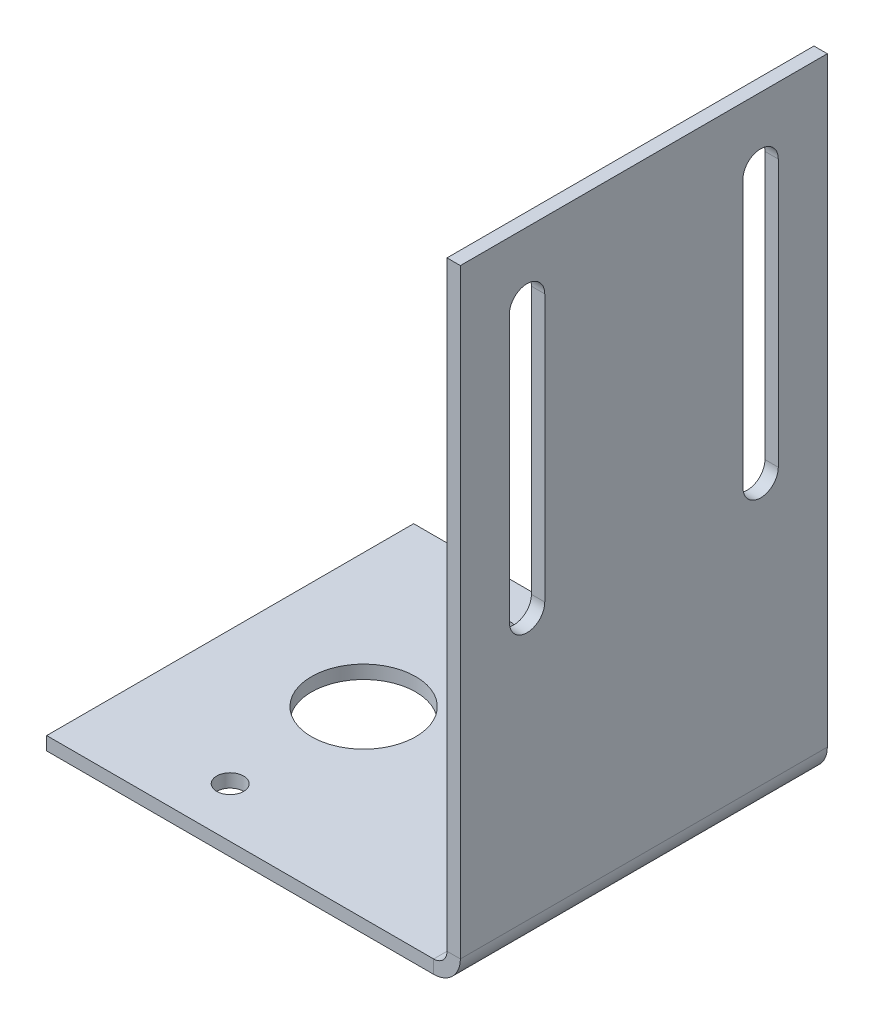
ISO-10303-21;
HEADER;
FILE_DESCRIPTION(('STEP AP214'),'2;1');
FILE_NAME('part.step','',(''),(''),'','','');
FILE_SCHEMA(('AUTOMOTIVE_DESIGN { 1 0 10303 214 1 1 1 1 }'));
ENDSEC;
DATA;
#1=APPLICATION_CONTEXT('core data for automotive mechanical design processes');
#2=APPLICATION_PROTOCOL_DEFINITION('international standard','automotive_design',2000,#1);
#3=PRODUCT_CONTEXT('',#1,'mechanical');
#4=PRODUCT('Part','Part','',(#3));
#5=PRODUCT_RELATED_PRODUCT_CATEGORY('part','',(#4));
#6=PRODUCT_DEFINITION_FORMATION('','',#4);
#7=PRODUCT_DEFINITION_CONTEXT('part definition',#1,'design');
#8=PRODUCT_DEFINITION('design','',#6,#7);
#9=PRODUCT_DEFINITION_SHAPE('','',#8);
#10=(LENGTH_UNIT() NAMED_UNIT(*) SI_UNIT(.MILLI.,.METRE.));
#11=(NAMED_UNIT(*) PLANE_ANGLE_UNIT() SI_UNIT($,.RADIAN.));
#12=(NAMED_UNIT(*) SI_UNIT($,.STERADIAN.) SOLID_ANGLE_UNIT());
#13=UNCERTAINTY_MEASURE_WITH_UNIT(LENGTH_MEASURE(1.E-05),#10,'distance_accuracy_value','');
#14=(GEOMETRIC_REPRESENTATION_CONTEXT(3) GLOBAL_UNCERTAINTY_ASSIGNED_CONTEXT((#13)) GLOBAL_UNIT_ASSIGNED_CONTEXT((#10,
#11,#12)) REPRESENTATION_CONTEXT('',''));
#15=CARTESIAN_POINT('',(0.,0.,0.));
#16=DIRECTION('',(0.,0.,1.));
#17=DIRECTION('',(1.,0.,0.));
#18=AXIS2_PLACEMENT_3D('',#15,#16,#17);
#19=CARTESIAN_POINT('',(0.,0.,0.));
#20=DIRECTION('',(0.,0.,-1.));
#21=DIRECTION('',(1.,0.,0.));
#22=AXIS2_PLACEMENT_3D('',#19,#20,#21);
#23=PLANE('',#22);
#24=DIRECTION('',(0.,-1.,0.));
#25=VECTOR('',#24,1.);
#26=CARTESIAN_POINT('',(73.66,0.,0.));
#27=LINE('',#26,#25);
#28=CARTESIAN_POINT('',(73.66,2.54,0.));
#29=VERTEX_POINT('',#28);
#30=CARTESIAN_POINT('',(73.66,0.,0.));
#31=VERTEX_POINT('',#30);
#32=EDGE_CURVE('E11',#29,#31,#27,.T.);
#33=ORIENTED_EDGE('',*,*,#32,.F.);
#34=DIRECTION('',(1.,0.,0.));
#35=VECTOR('',#34,1.);
#36=CARTESIAN_POINT('',(0.,2.54,0.));
#37=LINE('',#36,#35);
#38=CARTESIAN_POINT('',(0.,2.54,0.));
#39=VERTEX_POINT('',#38);
#40=EDGE_CURVE('E127',#39,#29,#37,.T.);
#41=ORIENTED_EDGE('',*,*,#40,.F.);
#42=DIRECTION('',(0.,-1.,0.));
#43=VECTOR('',#42,1.);
#44=CARTESIAN_POINT('',(0.,0.,0.));
#45=LINE('',#44,#43);
#46=CARTESIAN_POINT('',(0.,0.,0.));
#47=VERTEX_POINT('',#46);
#48=EDGE_CURVE('E63',#39,#47,#45,.T.);
#49=ORIENTED_EDGE('',*,*,#48,.T.);
#50=DIRECTION('',(1.,0.,0.));
#51=VECTOR('',#50,1.);
#52=CARTESIAN_POINT('',(0.,0.,0.));
#53=LINE('',#52,#51);
#54=EDGE_CURVE('E130',#47,#31,#53,.T.);
#55=ORIENTED_EDGE('',*,*,#54,.T.);
#56=EDGE_LOOP('',(#33,#41,#49,#55));
#57=FACE_BOUND('',#56,.T.);
#58=ADVANCED_FACE('F53',(#57),#23,.F.);
#59=CARTESIAN_POINT('',(0.,0.,-69.85));
#60=DIRECTION('',(1.,0.,0.));
#61=DIRECTION('',(0.,0.,1.));
#62=AXIS2_PLACEMENT_3D('',#59,#60,#61);
#63=PLANE('',#62);
#64=ORIENTED_EDGE('',*,*,#48,.F.);
#65=DIRECTION('',(0.,0.,-1.));
#66=VECTOR('',#65,1.);
#67=CARTESIAN_POINT('',(0.,2.54,-69.85));
#68=LINE('',#67,#66);
#69=CARTESIAN_POINT('',(0.,2.54,-69.85));
#70=VERTEX_POINT('',#69);
#71=EDGE_CURVE('E156',#70,#39,#68,.F.);
#72=ORIENTED_EDGE('',*,*,#71,.F.);
#73=DIRECTION('',(0.,-1.,0.));
#74=VECTOR('',#73,1.);
#75=CARTESIAN_POINT('',(0.,0.,-69.85));
#76=LINE('',#75,#74);
#77=CARTESIAN_POINT('',(0.,0.,-69.85));
#78=VERTEX_POINT('',#77);
#79=EDGE_CURVE('E217',#70,#78,#76,.T.);
#80=ORIENTED_EDGE('',*,*,#79,.T.);
#81=DIRECTION('',(0.,0.,1.));
#82=VECTOR('',#81,1.);
#83=CARTESIAN_POINT('',(0.,0.,-69.85));
#84=LINE('',#83,#82);
#85=EDGE_CURVE('E228',#78,#47,#84,.T.);
#86=ORIENTED_EDGE('',*,*,#85,.T.);
#87=EDGE_LOOP('',(#64,#72,#80,#86));
#88=FACE_BOUND('',#87,.T.);
#89=ADVANCED_FACE('F235',(#88),#63,.F.);
#90=CARTESIAN_POINT('',(0.,0.,-69.85));
#91=DIRECTION('',(0.,0.,-1.));
#92=DIRECTION('',(1.,0.,0.));
#93=AXIS2_PLACEMENT_3D('',#90,#91,#92);
#94=PLANE('',#93);
#95=ORIENTED_EDGE('',*,*,#79,.F.);
#96=DIRECTION('',(1.,0.,0.));
#97=VECTOR('',#96,1.);
#98=CARTESIAN_POINT('',(0.,2.54,-69.85));
#99=LINE('',#98,#97);
#100=CARTESIAN_POINT('',(73.66,2.54,-69.85));
#101=VERTEX_POINT('',#100);
#102=EDGE_CURVE('E306',#70,#101,#99,.T.);
#103=ORIENTED_EDGE('',*,*,#102,.T.);
#104=DIRECTION('',(0.,-1.,0.));
#105=VECTOR('',#104,1.);
#106=CARTESIAN_POINT('',(73.66,0.,-69.85));
#107=LINE('',#106,#105);
#108=CARTESIAN_POINT('',(73.66,0.,-69.85));
#109=VERTEX_POINT('',#108);
#110=EDGE_CURVE('E214',#101,#109,#107,.T.);
#111=ORIENTED_EDGE('',*,*,#110,.T.);
#112=DIRECTION('',(1.,0.,0.));
#113=VECTOR('',#112,1.);
#114=CARTESIAN_POINT('',(0.,0.,-69.85));
#115=LINE('',#114,#113);
#116=EDGE_CURVE('E237',#78,#109,#115,.T.);
#117=ORIENTED_EDGE('',*,*,#116,.F.);
#118=EDGE_LOOP('',(#95,#103,#111,#117));
#119=FACE_BOUND('',#118,.T.);
#120=ADVANCED_FACE('F381',(#119),#94,.T.);
#121=CARTESIAN_POINT('',(73.66,5.08,-69.85));
#122=DIRECTION('',(0.,0.,1.));
#123=DIRECTION('',(1.,0.,0.));
#124=AXIS2_PLACEMENT_3D('',#121,#122,#123);
#125=PLANE('',#124);
#126=ORIENTED_EDGE('',*,*,#110,.F.);
#127=CARTESIAN_POINT('',(73.66,5.08,-69.85));
#128=DIRECTION('',(0.,0.,1.));
#129=DIRECTION('',(1.,0.,0.));
#130=AXIS2_PLACEMENT_3D('',#127,#128,#129);
#131=CIRCLE('',#130,2.54);
#132=CARTESIAN_POINT('',(76.2,5.08,-69.85));
#133=VERTEX_POINT('',#132);
#134=EDGE_CURVE('E145',#101,#133,#131,.T.);
#135=ORIENTED_EDGE('',*,*,#134,.T.);
#136=DIRECTION('',(1.,0.,0.));
#137=VECTOR('',#136,1.);
#138=CARTESIAN_POINT('',(78.74,5.08,-69.85));
#139=LINE('',#138,#137);
#140=CARTESIAN_POINT('',(78.74,5.08,-69.85));
#141=VERTEX_POINT('',#140);
#142=EDGE_CURVE('E71',#133,#141,#139,.T.);
#143=ORIENTED_EDGE('',*,*,#142,.T.);
#144=CARTESIAN_POINT('',(73.66,5.08,-69.85));
#145=DIRECTION('',(0.,0.,-1.));
#146=DIRECTION('',(-1.,0.,0.));
#147=AXIS2_PLACEMENT_3D('',#144,#145,#146);
#148=CIRCLE('',#147,5.08);
#149=EDGE_CURVE('E296',#109,#141,#148,.F.);
#150=ORIENTED_EDGE('',*,*,#149,.F.);
#151=EDGE_LOOP('',(#126,#135,#143,#150));
#152=FACE_BOUND('',#151,.T.);
#153=ADVANCED_FACE('F443',(#152),#125,.F.);
#154=CARTESIAN_POINT('',(78.74,0.,-69.85));
#155=DIRECTION('',(0.,0.,-1.));
#156=DIRECTION('',(0.,1.,0.));
#157=AXIS2_PLACEMENT_3D('',#154,#155,#156);
#158=PLANE('',#157);
#159=ORIENTED_EDGE('',*,*,#142,.F.);
#160=DIRECTION('',(0.,1.,0.));
#161=VECTOR('',#160,1.);
#162=CARTESIAN_POINT('',(76.2,0.,-69.85));
#163=LINE('',#162,#161);
#164=CARTESIAN_POINT('',(76.2,119.38,-69.85));
#165=VERTEX_POINT('',#164);
#166=EDGE_CURVE('E338',#133,#165,#163,.T.);
#167=ORIENTED_EDGE('',*,*,#166,.T.);
#168=DIRECTION('',(1.,0.,0.));
#169=VECTOR('',#168,1.);
#170=CARTESIAN_POINT('',(78.74,119.38,-69.85));
#171=LINE('',#170,#169);
#172=CARTESIAN_POINT('',(78.74,119.38,-69.85));
#173=VERTEX_POINT('',#172);
#174=EDGE_CURVE('E210',#165,#173,#171,.T.);
#175=ORIENTED_EDGE('',*,*,#174,.T.);
#176=DIRECTION('',(0.,1.,0.));
#177=VECTOR('',#176,1.);
#178=CARTESIAN_POINT('',(78.74,0.,-69.85));
#179=LINE('',#178,#177);
#180=EDGE_CURVE('E281',#141,#173,#179,.T.);
#181=ORIENTED_EDGE('',*,*,#180,.F.);
#182=EDGE_LOOP('',(#159,#167,#175,#181));
#183=FACE_BOUND('',#182,.T.);
#184=ADVANCED_FACE('F432',(#183),#158,.T.);
#185=CARTESIAN_POINT('',(78.74,119.38,-69.85));
#186=DIRECTION('',(0.,1.,0.));
#187=DIRECTION('',(0.,0.,1.));
#188=AXIS2_PLACEMENT_3D('',#185,#186,#187);
#189=PLANE('',#188);
#190=ORIENTED_EDGE('',*,*,#174,.F.);
#191=DIRECTION('',(0.,0.,-1.));
#192=VECTOR('',#191,1.);
#193=CARTESIAN_POINT('',(76.2,119.38,-69.85));
#194=LINE('',#193,#192);
#195=CARTESIAN_POINT('',(76.2,119.38,0.));
#196=VERTEX_POINT('',#195);
#197=EDGE_CURVE('E151',#165,#196,#194,.F.);
#198=ORIENTED_EDGE('',*,*,#197,.T.);
#199=DIRECTION('',(1.,0.,0.));
#200=VECTOR('',#199,1.);
#201=CARTESIAN_POINT('',(78.74,119.38,0.));
#202=LINE('',#201,#200);
#203=CARTESIAN_POINT('',(78.74,119.38,0.));
#204=VERTEX_POINT('',#203);
#205=EDGE_CURVE('E207',#196,#204,#202,.T.);
#206=ORIENTED_EDGE('',*,*,#205,.T.);
#207=DIRECTION('',(0.,0.,1.));
#208=VECTOR('',#207,1.);
#209=CARTESIAN_POINT('',(78.74,119.38,-69.85));
#210=LINE('',#209,#208);
#211=EDGE_CURVE('E285',#173,#204,#210,.T.);
#212=ORIENTED_EDGE('',*,*,#211,.F.);
#213=EDGE_LOOP('',(#190,#198,#206,#212));
#214=FACE_BOUND('',#213,.T.);
#215=ADVANCED_FACE('F437',(#214),#189,.T.);
#216=CARTESIAN_POINT('',(78.74,0.,0.));
#217=DIRECTION('',(0.,0.,-1.));
#218=DIRECTION('',(0.,1.,0.));
#219=AXIS2_PLACEMENT_3D('',#216,#217,#218);
#220=PLANE('',#219);
#221=ORIENTED_EDGE('',*,*,#205,.F.);
#222=DIRECTION('',(0.,1.,0.));
#223=VECTOR('',#222,1.);
#224=CARTESIAN_POINT('',(76.2,0.,0.));
#225=LINE('',#224,#223);
#226=CARTESIAN_POINT('',(76.2,5.08,0.));
#227=VERTEX_POINT('',#226);
#228=EDGE_CURVE('E327',#227,#196,#225,.T.);
#229=ORIENTED_EDGE('',*,*,#228,.F.);
#230=DIRECTION('',(1.,0.,0.));
#231=VECTOR('',#230,1.);
#232=CARTESIAN_POINT('',(78.74,5.08,0.));
#233=LINE('',#232,#231);
#234=CARTESIAN_POINT('',(78.74,5.08,0.));
#235=VERTEX_POINT('',#234);
#236=EDGE_CURVE('E57',#227,#235,#233,.T.);
#237=ORIENTED_EDGE('',*,*,#236,.T.);
#238=DIRECTION('',(0.,1.,0.));
#239=VECTOR('',#238,1.);
#240=CARTESIAN_POINT('',(78.74,0.,0.));
#241=LINE('',#240,#239);
#242=EDGE_CURVE('E277',#235,#204,#241,.T.);
#243=ORIENTED_EDGE('',*,*,#242,.T.);
#244=EDGE_LOOP('',(#221,#229,#237,#243));
#245=FACE_BOUND('',#244,.T.);
#246=ADVANCED_FACE('F440',(#245),#220,.F.);
#247=CARTESIAN_POINT('',(78.74,55.88,-12.7));
#248=DIRECTION('',(1.,0.,0.));
#249=DIRECTION('',(0.,0.,-1.));
#250=AXIS2_PLACEMENT_3D('',#247,#248,#249);
#251=CYLINDRICAL_SURFACE('',#250,3.3655);
#252=DIRECTION('',(1.,0.,0.));
#253=VECTOR('',#252,1.);
#254=CARTESIAN_POINT('',(78.74,55.88,-16.0655));
#255=LINE('',#254,#253);
#256=CARTESIAN_POINT('',(76.2,55.88,-16.0655));
#257=VERTEX_POINT('',#256);
#258=CARTESIAN_POINT('',(78.74,55.88,-16.0655));
#259=VERTEX_POINT('',#258);
#260=EDGE_CURVE('E202',#257,#259,#255,.T.);
#261=ORIENTED_EDGE('',*,*,#260,.F.);
#262=CARTESIAN_POINT('',(76.2,55.88,-12.7));
#263=DIRECTION('',(-1.,0.,0.));
#264=DIRECTION('',(0.,-1.,0.));
#265=AXIS2_PLACEMENT_3D('',#262,#263,#264);
#266=CIRCLE('',#265,3.3655);
#267=CARTESIAN_POINT('',(76.2,55.88,-9.33449999999999));
#268=VERTEX_POINT('',#267);
#269=EDGE_CURVE('E328',#257,#268,#266,.T.);
#270=ORIENTED_EDGE('',*,*,#269,.T.);
#271=DIRECTION('',(1.,0.,0.));
#272=VECTOR('',#271,1.);
#273=CARTESIAN_POINT('',(78.74,55.88,-9.33449999999999));
#274=LINE('',#273,#272);
#275=CARTESIAN_POINT('',(78.74,55.88,-9.33449999999999));
#276=VERTEX_POINT('',#275);
#277=EDGE_CURVE('E199',#268,#276,#274,.T.);
#278=ORIENTED_EDGE('',*,*,#277,.T.);
#279=CARTESIAN_POINT('',(78.74,55.88,-12.7));
#280=DIRECTION('',(-1.,0.,0.));
#281=DIRECTION('',(0.,-1.,0.));
#282=AXIS2_PLACEMENT_3D('',#279,#280,#281);
#283=CIRCLE('',#282,3.3655);
#284=EDGE_CURVE('E269',#259,#276,#283,.T.);
#285=ORIENTED_EDGE('',*,*,#284,.F.);
#286=EDGE_LOOP('',(#261,#270,#278,#285));
#287=FACE_BOUND('',#286,.T.);
#288=ADVANCED_FACE('F491',(#287),#251,.F.);
#289=CARTESIAN_POINT('',(78.74,106.68,-9.3345));
#290=DIRECTION('',(0.,0.,-1.));
#291=DIRECTION('',(0.,1.,0.));
#292=AXIS2_PLACEMENT_3D('',#289,#290,#291);
#293=PLANE('',#292);
#294=ORIENTED_EDGE('',*,*,#277,.F.);
#295=DIRECTION('',(0.,1.,0.));
#296=VECTOR('',#295,1.);
#297=CARTESIAN_POINT('',(76.2,0.,-9.33449999999999));
#298=LINE('',#297,#296);
#299=CARTESIAN_POINT('',(76.2,106.68,-9.33449999999999));
#300=VERTEX_POINT('',#299);
#301=EDGE_CURVE('E323',#268,#300,#298,.T.);
#302=ORIENTED_EDGE('',*,*,#301,.T.);
#303=DIRECTION('',(1.,0.,0.));
#304=VECTOR('',#303,1.);
#305=CARTESIAN_POINT('',(78.74,106.68,-9.3345));
#306=LINE('',#305,#304);
#307=CARTESIAN_POINT('',(78.74,106.68,-9.3345));
#308=VERTEX_POINT('',#307);
#309=EDGE_CURVE('E196',#300,#308,#306,.T.);
#310=ORIENTED_EDGE('',*,*,#309,.T.);
#311=DIRECTION('',(0.,1.,0.));
#312=VECTOR('',#311,1.);
#313=CARTESIAN_POINT('',(78.74,106.68,-9.3345));
#314=LINE('',#313,#312);
#315=EDGE_CURVE('E273',#276,#308,#314,.T.);
#316=ORIENTED_EDGE('',*,*,#315,.F.);
#317=EDGE_LOOP('',(#294,#302,#310,#316));
#318=FACE_BOUND('',#317,.T.);
#319=ADVANCED_FACE('F487',(#318),#293,.T.);
#320=CARTESIAN_POINT('',(78.74,106.68,-12.7));
#321=DIRECTION('',(1.,0.,0.));
#322=DIRECTION('',(0.,0.,-1.));
#323=AXIS2_PLACEMENT_3D('',#320,#321,#322);
#324=CYLINDRICAL_SURFACE('',#323,3.3655);
#325=ORIENTED_EDGE('',*,*,#309,.F.);
#326=CARTESIAN_POINT('',(76.2,106.68,-12.7));
#327=DIRECTION('',(-1.,0.,0.));
#328=DIRECTION('',(0.,-1.,0.));
#329=AXIS2_PLACEMENT_3D('',#326,#327,#328);
#330=CIRCLE('',#329,3.3655);
#331=CARTESIAN_POINT('',(76.2,106.68,-16.0655));
#332=VERTEX_POINT('',#331);
#333=EDGE_CURVE('E311',#300,#332,#330,.T.);
#334=ORIENTED_EDGE('',*,*,#333,.T.);
#335=DIRECTION('',(1.,0.,0.));
#336=VECTOR('',#335,1.);
#337=CARTESIAN_POINT('',(78.74,106.68,-16.0655));
#338=LINE('',#337,#336);
#339=CARTESIAN_POINT('',(78.74,106.68,-16.0655));
#340=VERTEX_POINT('',#339);
#341=EDGE_CURVE('E192',#332,#340,#338,.T.);
#342=ORIENTED_EDGE('',*,*,#341,.T.);
#343=CARTESIAN_POINT('',(78.74,106.68,-12.7));
#344=DIRECTION('',(-1.,0.,0.));
#345=DIRECTION('',(0.,-1.,0.));
#346=AXIS2_PLACEMENT_3D('',#343,#344,#345);
#347=CIRCLE('',#346,3.3655);
#348=EDGE_CURVE('E261',#308,#340,#347,.T.);
#349=ORIENTED_EDGE('',*,*,#348,.F.);
#350=EDGE_LOOP('',(#325,#334,#342,#349));
#351=FACE_BOUND('',#350,.T.);
#352=ADVANCED_FACE('F480',(#351),#324,.F.);
#353=CARTESIAN_POINT('',(78.74,55.88,-57.15));
#354=DIRECTION('',(1.,0.,0.));
#355=DIRECTION('',(0.,0.,-1.));
#356=AXIS2_PLACEMENT_3D('',#353,#354,#355);
#357=CYLINDRICAL_SURFACE('',#356,3.3655);
#358=DIRECTION('',(1.,0.,0.));
#359=VECTOR('',#358,1.);
#360=CARTESIAN_POINT('',(78.74,55.88,-60.5155));
#361=LINE('',#360,#359);
#362=CARTESIAN_POINT('',(76.2,55.88,-60.5155));
#363=VERTEX_POINT('',#362);
#364=CARTESIAN_POINT('',(78.74,55.88,-60.5155));
#365=VERTEX_POINT('',#364);
#366=EDGE_CURVE('E189',#363,#365,#361,.T.);
#367=ORIENTED_EDGE('',*,*,#366,.F.);
#368=CARTESIAN_POINT('',(76.2,55.88,-57.15));
#369=DIRECTION('',(-1.,0.,0.));
#370=DIRECTION('',(0.,-1.,0.));
#371=AXIS2_PLACEMENT_3D('',#368,#369,#370);
#372=CIRCLE('',#371,3.3655);
#373=CARTESIAN_POINT('',(76.2,55.88,-53.7845));
#374=VERTEX_POINT('',#373);
#375=EDGE_CURVE('E312',#363,#374,#372,.T.);
#376=ORIENTED_EDGE('',*,*,#375,.T.);
#377=DIRECTION('',(1.,0.,0.));
#378=VECTOR('',#377,1.);
#379=CARTESIAN_POINT('',(78.74,55.88,-53.7845));
#380=LINE('',#379,#378);
#381=CARTESIAN_POINT('',(78.74,55.88,-53.7845));
#382=VERTEX_POINT('',#381);
#383=EDGE_CURVE('E185',#374,#382,#380,.T.);
#384=ORIENTED_EDGE('',*,*,#383,.T.);
#385=CARTESIAN_POINT('',(78.74,55.88,-57.15));
#386=DIRECTION('',(-1.,0.,0.));
#387=DIRECTION('',(0.,-1.,0.));
#388=AXIS2_PLACEMENT_3D('',#385,#386,#387);
#389=CIRCLE('',#388,3.3655);
#390=EDGE_CURVE('E253',#365,#382,#389,.T.);
#391=ORIENTED_EDGE('',*,*,#390,.F.);
#392=EDGE_LOOP('',(#367,#376,#384,#391));
#393=FACE_BOUND('',#392,.T.);
#394=ADVANCED_FACE('F468',(#393),#357,.F.);
#395=CARTESIAN_POINT('',(78.74,106.68,-53.7845));
#396=DIRECTION('',(0.,0.,-1.));
#397=DIRECTION('',(0.,1.,0.));
#398=AXIS2_PLACEMENT_3D('',#395,#396,#397);
#399=PLANE('',#398);
#400=ORIENTED_EDGE('',*,*,#383,.F.);
#401=DIRECTION('',(0.,1.,0.));
#402=VECTOR('',#401,1.);
#403=CARTESIAN_POINT('',(76.2,0.,-53.7845));
#404=LINE('',#403,#402);
#405=CARTESIAN_POINT('',(76.2,106.68,-53.7845));
#406=VERTEX_POINT('',#405);
#407=EDGE_CURVE('E307',#374,#406,#404,.T.);
#408=ORIENTED_EDGE('',*,*,#407,.T.);
#409=DIRECTION('',(1.,0.,0.));
#410=VECTOR('',#409,1.);
#411=CARTESIAN_POINT('',(78.74,106.68,-53.7845));
#412=LINE('',#411,#410);
#413=CARTESIAN_POINT('',(78.74,106.68,-53.7845));
#414=VERTEX_POINT('',#413);
#415=EDGE_CURVE('E182',#406,#414,#412,.T.);
#416=ORIENTED_EDGE('',*,*,#415,.T.);
#417=DIRECTION('',(0.,1.,0.));
#418=VECTOR('',#417,1.);
#419=CARTESIAN_POINT('',(78.74,106.68,-53.7845));
#420=LINE('',#419,#418);
#421=EDGE_CURVE('E257',#382,#414,#420,.T.);
#422=ORIENTED_EDGE('',*,*,#421,.F.);
#423=EDGE_LOOP('',(#400,#408,#416,#422));
#424=FACE_BOUND('',#423,.T.);
#425=ADVANCED_FACE('F472',(#424),#399,.T.);
#426=CARTESIAN_POINT('',(78.74,106.68,-57.15));
#427=DIRECTION('',(1.,0.,0.));
#428=DIRECTION('',(0.,0.,-1.));
#429=AXIS2_PLACEMENT_3D('',#426,#427,#428);
#430=CYLINDRICAL_SURFACE('',#429,3.3655);
#431=ORIENTED_EDGE('',*,*,#415,.F.);
#432=CARTESIAN_POINT('',(76.2,106.68,-57.15));
#433=DIRECTION('',(-1.,0.,0.));
#434=DIRECTION('',(0.,-1.,0.));
#435=AXIS2_PLACEMENT_3D('',#432,#433,#434);
#436=CIRCLE('',#435,3.3655);
#437=CARTESIAN_POINT('',(76.2,106.68,-60.5155));
#438=VERTEX_POINT('',#437);
#439=EDGE_CURVE('E301',#406,#438,#436,.T.);
#440=ORIENTED_EDGE('',*,*,#439,.T.);
#441=DIRECTION('',(1.,0.,0.));
#442=VECTOR('',#441,1.);
#443=CARTESIAN_POINT('',(78.74,106.68,-60.5155));
#444=LINE('',#443,#442);
#445=CARTESIAN_POINT('',(78.74,106.68,-60.5155));
#446=VERTEX_POINT('',#445);
#447=EDGE_CURVE('E186',#438,#446,#444,.T.);
#448=ORIENTED_EDGE('',*,*,#447,.T.);
#449=CARTESIAN_POINT('',(78.74,106.68,-57.15));
#450=DIRECTION('',(-1.,0.,0.));
#451=DIRECTION('',(0.,-1.,0.));
#452=AXIS2_PLACEMENT_3D('',#449,#450,#451);
#453=CIRCLE('',#452,3.3655);
#454=EDGE_CURVE('E242',#414,#446,#453,.T.);
#455=ORIENTED_EDGE('',*,*,#454,.F.);
#456=EDGE_LOOP('',(#431,#440,#448,#455));
#457=FACE_BOUND('',#456,.T.);
#458=ADVANCED_FACE('F391',(#457),#430,.F.);
#459=CARTESIAN_POINT('',(25.4,0.,-34.925));
#460=DIRECTION('',(0.,-1.,0.));
#461=DIRECTION('',(0.,0.,-1.));
#462=AXIS2_PLACEMENT_3D('',#459,#460,#461);
#463=CYLINDRICAL_SURFACE('',#462,9.921875);
#464=CARTESIAN_POINT('',(25.4,0.,-34.925));
#465=DIRECTION('',(0.,-1.,0.));
#466=DIRECTION('',(0.,0.,-1.));
#467=AXIS2_PLACEMENT_3D('',#464,#465,#466);
#468=CIRCLE('',#467,9.921875);
#469=CARTESIAN_POINT('',(25.4,0.,-44.846875));
#470=VERTEX_POINT('',#469);
#471=EDGE_CURVE('E299',#470,#470,#468,.T.);
#472=ORIENTED_EDGE('',*,*,#471,.T.);
#473=EDGE_LOOP('',(#472));
#474=FACE_BOUND('',#473,.T.);
#475=CARTESIAN_POINT('',(25.4,2.54,-34.925));
#476=DIRECTION('',(0.,-1.,0.));
#477=DIRECTION('',(0.,0.,-1.));
#478=AXIS2_PLACEMENT_3D('',#475,#476,#477);
#479=CIRCLE('',#478,9.921875);
#480=CARTESIAN_POINT('',(25.4,2.54,-44.846875));
#481=VERTEX_POINT('',#480);
#482=EDGE_CURVE('E168',#481,#481,#479,.T.);
#483=ORIENTED_EDGE('',*,*,#482,.F.);
#484=EDGE_LOOP('',(#483));
#485=FACE_BOUND('',#484,.T.);
#486=ADVANCED_FACE('F389',(#474,#485),#463,.F.);
#487=CARTESIAN_POINT('',(25.3999999999999,0.,-9.5249999999993));
#488=DIRECTION('',(0.,-1.,0.));
#489=DIRECTION('',(0.,0.,-1.));
#490=AXIS2_PLACEMENT_3D('',#487,#488,#489);
#491=CYLINDRICAL_SURFACE('',#490,2.5527);
#492=CARTESIAN_POINT('',(25.3999999999999,0.,-9.5249999999993));
#493=DIRECTION('',(0.,1.,0.));
#494=DIRECTION('',(0.,0.,1.));
#495=AXIS2_PLACEMENT_3D('',#492,#493,#494);
#496=CIRCLE('',#495,2.5527);
#497=CARTESIAN_POINT('',(25.3999999999999,0.,-6.9722999999993));
#498=VERTEX_POINT('',#497);
#499=EDGE_CURVE('E346',#498,#498,#496,.T.);
#500=ORIENTED_EDGE('',*,*,#499,.F.);
#501=EDGE_LOOP('',(#500));
#502=FACE_BOUND('',#501,.T.);
#503=CARTESIAN_POINT('',(25.3999999999999,2.54,-9.5249999999993));
#504=DIRECTION('',(0.,1.,0.));
#505=DIRECTION('',(0.,0.,1.));
#506=AXIS2_PLACEMENT_3D('',#503,#504,#505);
#507=CIRCLE('',#506,2.5527);
#508=CARTESIAN_POINT('',(25.3999999999999,2.54,-6.9722999999993));
#509=VERTEX_POINT('',#508);
#510=EDGE_CURVE('E175',#509,#509,#507,.T.);
#511=ORIENTED_EDGE('',*,*,#510,.T.);
#512=EDGE_LOOP('',(#511));
#513=FACE_BOUND('',#512,.T.);
#514=ADVANCED_FACE('F360',(#502,#513),#491,.F.);
#515=CARTESIAN_POINT('',(25.3999999999999,0.,-60.3249999999999));
#516=DIRECTION('',(0.,-1.,0.));
#517=DIRECTION('',(0.,0.,-1.));
#518=AXIS2_PLACEMENT_3D('',#515,#516,#517);
#519=CYLINDRICAL_SURFACE('',#518,2.5527);
#520=CARTESIAN_POINT('',(25.3999999999999,0.,-60.3249999999999));
#521=DIRECTION('',(0.,1.,0.));
#522=DIRECTION('',(0.,0.,1.));
#523=AXIS2_PLACEMENT_3D('',#520,#521,#522);
#524=CIRCLE('',#523,2.5527);
#525=CARTESIAN_POINT('',(25.3999999999999,0.,-57.7722999999999));
#526=VERTEX_POINT('',#525);
#527=EDGE_CURVE('E233',#526,#526,#524,.T.);
#528=ORIENTED_EDGE('',*,*,#527,.F.);
#529=EDGE_LOOP('',(#528));
#530=FACE_BOUND('',#529,.T.);
#531=CARTESIAN_POINT('',(25.3999999999999,2.54,-60.3249999999999));
#532=DIRECTION('',(0.,1.,0.));
#533=DIRECTION('',(0.,0.,1.));
#534=AXIS2_PLACEMENT_3D('',#531,#532,#533);
#535=CIRCLE('',#534,2.5527);
#536=CARTESIAN_POINT('',(25.3999999999999,2.54,-57.7722999999999));
#537=VERTEX_POINT('',#536);
#538=EDGE_CURVE('E158',#537,#537,#535,.T.);
#539=ORIENTED_EDGE('',*,*,#538,.T.);
#540=EDGE_LOOP('',(#539));
#541=FACE_BOUND('',#540,.T.);
#542=ADVANCED_FACE('F55',(#530,#541),#519,.F.);
#543=CARTESIAN_POINT('',(78.74,106.68,-60.5155));
#544=DIRECTION('',(0.,0.,1.));
#545=DIRECTION('',(0.,-1.,0.));
#546=AXIS2_PLACEMENT_3D('',#543,#544,#545);
#547=PLANE('',#546);
#548=DIRECTION('',(0.,1.,0.));
#549=VECTOR('',#548,1.);
#550=CARTESIAN_POINT('',(76.2,0.,-60.5155));
#551=LINE('',#550,#549);
#552=EDGE_CURVE('E305',#438,#363,#551,.F.);
#553=ORIENTED_EDGE('',*,*,#552,.T.);
#554=ORIENTED_EDGE('',*,*,#366,.T.);
#555=DIRECTION('',(0.,-1.,0.));
#556=VECTOR('',#555,1.);
#557=CARTESIAN_POINT('',(78.74,106.68,-60.5155));
#558=LINE('',#557,#556);
#559=EDGE_CURVE('E249',#446,#365,#558,.T.);
#560=ORIENTED_EDGE('',*,*,#559,.F.);
#561=ORIENTED_EDGE('',*,*,#447,.F.);
#562=EDGE_LOOP('',(#553,#554,#560,#561));
#563=FACE_BOUND('',#562,.T.);
#564=ADVANCED_FACE('F359',(#563),#547,.T.);
#565=CARTESIAN_POINT('',(78.74,106.68,-16.0655));
#566=DIRECTION('',(0.,0.,1.));
#567=DIRECTION('',(0.,-1.,0.));
#568=AXIS2_PLACEMENT_3D('',#565,#566,#567);
#569=PLANE('',#568);
#570=DIRECTION('',(0.,1.,0.));
#571=VECTOR('',#570,1.);
#572=CARTESIAN_POINT('',(76.2,0.,-16.0655));
#573=LINE('',#572,#571);
#574=EDGE_CURVE('E322',#332,#257,#573,.F.);
#575=ORIENTED_EDGE('',*,*,#574,.T.);
#576=ORIENTED_EDGE('',*,*,#260,.T.);
#577=DIRECTION('',(0.,-1.,0.));
#578=VECTOR('',#577,1.);
#579=CARTESIAN_POINT('',(78.74,106.68,-16.0655));
#580=LINE('',#579,#578);
#581=EDGE_CURVE('E265',#340,#259,#580,.T.);
#582=ORIENTED_EDGE('',*,*,#581,.F.);
#583=ORIENTED_EDGE('',*,*,#341,.F.);
#584=EDGE_LOOP('',(#575,#576,#582,#583));
#585=FACE_BOUND('',#584,.T.);
#586=ADVANCED_FACE('F388',(#585),#569,.T.);
#587=CARTESIAN_POINT('',(73.66,5.08,0.));
#588=DIRECTION('',(0.,0.,-1.));
#589=DIRECTION('',(-1.,0.,0.));
#590=AXIS2_PLACEMENT_3D('',#587,#588,#589);
#591=PLANE('',#590);
#592=CARTESIAN_POINT('',(73.66,5.08,0.));
#593=DIRECTION('',(0.,0.,1.));
#594=DIRECTION('',(1.,0.,0.));
#595=AXIS2_PLACEMENT_3D('',#592,#593,#594);
#596=CIRCLE('',#595,2.54);
#597=EDGE_CURVE('E143',#227,#29,#596,.F.);
#598=ORIENTED_EDGE('',*,*,#597,.T.);
#599=ORIENTED_EDGE('',*,*,#32,.T.);
#600=CARTESIAN_POINT('',(73.66,5.08,0.));
#601=DIRECTION('',(0.,0.,1.));
#602=DIRECTION('',(1.,0.,0.));
#603=AXIS2_PLACEMENT_3D('',#600,#601,#602);
#604=CIRCLE('',#603,5.08);
#605=EDGE_CURVE('E294',#235,#31,#604,.F.);
#606=ORIENTED_EDGE('',*,*,#605,.F.);
#607=ORIENTED_EDGE('',*,*,#236,.F.);
#608=EDGE_LOOP('',(#598,#599,#606,#607));
#609=FACE_BOUND('',#608,.T.);
#610=ADVANCED_FACE('F161',(#609),#591,.F.);
#611=CARTESIAN_POINT('',(78.74,0.,-69.85));
#612=DIRECTION('',(1.,0.,0.));
#613=DIRECTION('',(0.,0.,-1.));
#614=AXIS2_PLACEMENT_3D('',#611,#612,#613);
#615=PLANE('',#614);
#616=ORIENTED_EDGE('',*,*,#454,.T.);
#617=ORIENTED_EDGE('',*,*,#559,.T.);
#618=ORIENTED_EDGE('',*,*,#390,.T.);
#619=ORIENTED_EDGE('',*,*,#421,.T.);
#620=EDGE_LOOP('',(#616,#617,#618,#619));
#621=FACE_BOUND('',#620,.T.);
#622=ORIENTED_EDGE('',*,*,#348,.T.);
#623=ORIENTED_EDGE('',*,*,#581,.T.);
#624=ORIENTED_EDGE('',*,*,#284,.T.);
#625=ORIENTED_EDGE('',*,*,#315,.T.);
#626=EDGE_LOOP('',(#622,#623,#624,#625));
#627=FACE_BOUND('',#626,.T.);
#628=ORIENTED_EDGE('',*,*,#242,.F.);
#629=DIRECTION('',(0.,0.,1.));
#630=VECTOR('',#629,1.);
#631=CARTESIAN_POINT('',(78.74,5.08,-69.85));
#632=LINE('',#631,#630);
#633=EDGE_CURVE('E195',#235,#141,#632,.F.);
#634=ORIENTED_EDGE('',*,*,#633,.T.);
#635=ORIENTED_EDGE('',*,*,#180,.T.);
#636=ORIENTED_EDGE('',*,*,#211,.T.);
#637=EDGE_LOOP('',(#628,#634,#635,#636));
#638=FACE_BOUND('',#637,.T.);
#639=ADVANCED_FACE('F387',(#621,#627,#638),#615,.T.);
#640=CARTESIAN_POINT('',(0.,0.,-69.85));
#641=DIRECTION('',(0.,-1.,0.));
#642=DIRECTION('',(0.,0.,-1.));
#643=AXIS2_PLACEMENT_3D('',#640,#641,#642);
#644=PLANE('',#643);
#645=ORIENTED_EDGE('',*,*,#471,.F.);
#646=EDGE_LOOP('',(#645));
#647=FACE_BOUND('',#646,.T.);
#648=ORIENTED_EDGE('',*,*,#499,.T.);
#649=EDGE_LOOP('',(#648));
#650=FACE_BOUND('',#649,.T.);
#651=ORIENTED_EDGE('',*,*,#527,.T.);
#652=EDGE_LOOP('',(#651));
#653=FACE_BOUND('',#652,.T.);
#654=ORIENTED_EDGE('',*,*,#116,.T.);
#655=DIRECTION('',(0.,0.,1.));
#656=VECTOR('',#655,1.);
#657=CARTESIAN_POINT('',(73.66,0.,-69.85));
#658=LINE('',#657,#656);
#659=EDGE_CURVE('E231',#109,#31,#658,.T.);
#660=ORIENTED_EDGE('',*,*,#659,.T.);
#661=ORIENTED_EDGE('',*,*,#54,.F.);
#662=ORIENTED_EDGE('',*,*,#85,.F.);
#663=EDGE_LOOP('',(#654,#660,#661,#662));
#664=FACE_BOUND('',#663,.T.);
#665=ADVANCED_FACE('F227',(#647,#650,#653,#664),#644,.T.);
#666=CARTESIAN_POINT('',(73.66,5.08,-69.85));
#667=DIRECTION('',(0.,0.,1.));
#668=DIRECTION('',(1.,0.,0.));
#669=AXIS2_PLACEMENT_3D('',#666,#667,#668);
#670=CYLINDRICAL_SURFACE('',#669,5.08);
#671=ORIENTED_EDGE('',*,*,#149,.T.);
#672=ORIENTED_EDGE('',*,*,#633,.F.);
#673=ORIENTED_EDGE('',*,*,#605,.T.);
#674=ORIENTED_EDGE('',*,*,#659,.F.);
#675=EDGE_LOOP('',(#671,#672,#673,#674));
#676=FACE_BOUND('',#675,.T.);
#677=ADVANCED_FACE('F372',(#676),#670,.T.);
#678=CARTESIAN_POINT('',(76.2,0.,-69.85));
#679=DIRECTION('',(1.,0.,0.));
#680=DIRECTION('',(0.,0.,-1.));
#681=AXIS2_PLACEMENT_3D('',#678,#679,#680);
#682=PLANE('',#681);
#683=ORIENTED_EDGE('',*,*,#439,.F.);
#684=ORIENTED_EDGE('',*,*,#407,.F.);
#685=ORIENTED_EDGE('',*,*,#375,.F.);
#686=ORIENTED_EDGE('',*,*,#552,.F.);
#687=EDGE_LOOP('',(#683,#684,#685,#686));
#688=FACE_BOUND('',#687,.T.);
#689=ORIENTED_EDGE('',*,*,#333,.F.);
#690=ORIENTED_EDGE('',*,*,#301,.F.);
#691=ORIENTED_EDGE('',*,*,#269,.F.);
#692=ORIENTED_EDGE('',*,*,#574,.F.);
#693=EDGE_LOOP('',(#689,#690,#691,#692));
#694=FACE_BOUND('',#693,.T.);
#695=ORIENTED_EDGE('',*,*,#228,.T.);
#696=ORIENTED_EDGE('',*,*,#197,.F.);
#697=ORIENTED_EDGE('',*,*,#166,.F.);
#698=DIRECTION('',(0.,0.,-1.));
#699=VECTOR('',#698,1.);
#700=CARTESIAN_POINT('',(76.2,5.08,-69.85));
#701=LINE('',#700,#699);
#702=EDGE_CURVE('E150',#227,#133,#701,.T.);
#703=ORIENTED_EDGE('',*,*,#702,.F.);
#704=EDGE_LOOP('',(#695,#696,#697,#703));
#705=FACE_BOUND('',#704,.T.);
#706=ADVANCED_FACE('F364',(#688,#694,#705),#682,.F.);
#707=CARTESIAN_POINT('',(0.,2.54,-69.85));
#708=DIRECTION('',(0.,-1.,0.));
#709=DIRECTION('',(0.,0.,-1.));
#710=AXIS2_PLACEMENT_3D('',#707,#708,#709);
#711=PLANE('',#710);
#712=ORIENTED_EDGE('',*,*,#482,.T.);
#713=EDGE_LOOP('',(#712));
#714=FACE_BOUND('',#713,.T.);
#715=ORIENTED_EDGE('',*,*,#510,.F.);
#716=EDGE_LOOP('',(#715));
#717=FACE_BOUND('',#716,.T.);
#718=ORIENTED_EDGE('',*,*,#538,.F.);
#719=EDGE_LOOP('',(#718));
#720=FACE_BOUND('',#719,.T.);
#721=ORIENTED_EDGE('',*,*,#102,.F.);
#722=ORIENTED_EDGE('',*,*,#71,.T.);
#723=ORIENTED_EDGE('',*,*,#40,.T.);
#724=DIRECTION('',(0.,0.,-1.));
#725=VECTOR('',#724,1.);
#726=CARTESIAN_POINT('',(73.66,2.54,-69.85));
#727=LINE('',#726,#725);
#728=EDGE_CURVE('E140',#101,#29,#727,.F.);
#729=ORIENTED_EDGE('',*,*,#728,.F.);
#730=EDGE_LOOP('',(#721,#722,#723,#729));
#731=FACE_BOUND('',#730,.T.);
#732=ADVANCED_FACE('F154',(#714,#717,#720,#731),#711,.F.);
#733=CARTESIAN_POINT('',(73.66,5.08,-69.85));
#734=DIRECTION('',(0.,0.,1.));
#735=DIRECTION('',(1.,0.,0.));
#736=AXIS2_PLACEMENT_3D('',#733,#734,#735);
#737=CYLINDRICAL_SURFACE('',#736,2.54);
#738=ORIENTED_EDGE('',*,*,#134,.F.);
#739=ORIENTED_EDGE('',*,*,#728,.T.);
#740=ORIENTED_EDGE('',*,*,#597,.F.);
#741=ORIENTED_EDGE('',*,*,#702,.T.);
#742=EDGE_LOOP('',(#738,#739,#740,#741));
#743=FACE_BOUND('',#742,.T.);
#744=ADVANCED_FACE('F141',(#743),#737,.F.);
#745=CLOSED_SHELL('',(#58,#89,#120,#153,#184,#215,#246,#288,#319,#352,#394,#425,#458,#486,#514,
#542,#564,#586,#610,#639,#665,#677,#706,#732,#744));
#746=MANIFOLD_SOLID_BREP('B2',#745);
#747=ADVANCED_BREP_SHAPE_REPRESENTATION('',(#18,#746),#14);
#748=SHAPE_DEFINITION_REPRESENTATION(#9,#747);
ENDSEC;
END-ISO-10303-21;
